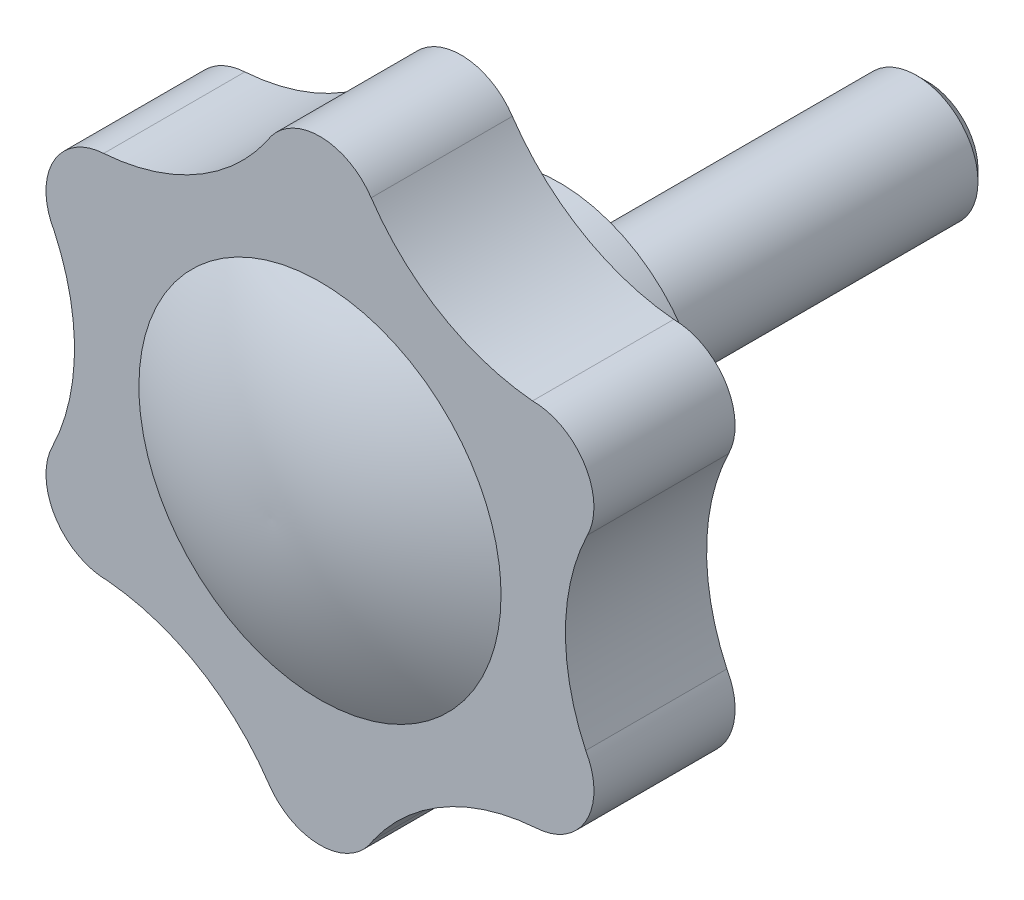
ISO-10303-21;
HEADER;
FILE_DESCRIPTION(('STEP AP214'),'2;1');
FILE_NAME('part.step','',(''),(''),'','','');
FILE_SCHEMA(('AUTOMOTIVE_DESIGN { 1 0 10303 214 1 1 1 1 }'));
ENDSEC;
DATA;
#1=APPLICATION_CONTEXT('core data for automotive mechanical design processes');
#2=APPLICATION_PROTOCOL_DEFINITION('international standard','automotive_design',2000,#1);
#3=PRODUCT_CONTEXT('',#1,'mechanical');
#4=PRODUCT('Part','Part','',(#3));
#5=PRODUCT_RELATED_PRODUCT_CATEGORY('part','',(#4));
#6=PRODUCT_DEFINITION_FORMATION('','',#4);
#7=PRODUCT_DEFINITION_CONTEXT('part definition',#1,'design');
#8=PRODUCT_DEFINITION('design','',#6,#7);
#9=PRODUCT_DEFINITION_SHAPE('','',#8);
#10=(LENGTH_UNIT() NAMED_UNIT(*) SI_UNIT(.MILLI.,.METRE.));
#11=(NAMED_UNIT(*) PLANE_ANGLE_UNIT() SI_UNIT($,.RADIAN.));
#12=(NAMED_UNIT(*) SI_UNIT($,.STERADIAN.) SOLID_ANGLE_UNIT());
#13=UNCERTAINTY_MEASURE_WITH_UNIT(LENGTH_MEASURE(1.E-05),#10,'distance_accuracy_value','');
#14=(GEOMETRIC_REPRESENTATION_CONTEXT(3) GLOBAL_UNCERTAINTY_ASSIGNED_CONTEXT((#13)) GLOBAL_UNIT_ASSIGNED_CONTEXT((#10,
#11,#12)) REPRESENTATION_CONTEXT('',''));
#15=CARTESIAN_POINT('',(0.,0.,0.));
#16=DIRECTION('',(0.,0.,1.));
#17=DIRECTION('',(1.,0.,0.));
#18=AXIS2_PLACEMENT_3D('',#15,#16,#17);
#19=CARTESIAN_POINT('',(9.05529978597193,10.6755648382448,5.75));
#20=DIRECTION('',(0.,0.,1.));
#21=DIRECTION('',(1.,0.,0.));
#22=AXIS2_PLACEMENT_3D('',#19,#20,#21);
#23=PLANE('',#22);
#24=CARTESIAN_POINT('',(9.45034553409947,16.3511296764895,5.75));
#25=DIRECTION('',(0.,0.,-1.));
#26=DIRECTION('',(1.,0.,0.));
#27=AXIS2_PLACEMENT_3D('',#24,#25,#26);
#28=CIRCLE('',#27,8.8863232623222);
#29=CARTESIAN_POINT('',(8.66025403784439,7.50000000000022,5.75));
#30=VERTEX_POINT('',#29);
#31=CARTESIAN_POINT('',(2.0863780504961,11.3773258984016,5.75));
#32=VERTEX_POINT('',#31);
#33=EDGE_CURVE('E216',#30,#32,#28,.T.);
#34=ORIENTED_EDGE('',*,*,#33,.T.);
#35=CARTESIAN_POINT('',(0.,10.,5.75));
#36=DIRECTION('',(0.,0.,1.));
#37=DIRECTION('',(1.,0.,0.));
#38=AXIS2_PLACEMENT_3D('',#35,#36,#37);
#39=CIRCLE('',#38,2.49999999999994);
#40=CARTESIAN_POINT('',(-2.16506350946132,11.2499999999995,5.75));
#41=VERTEX_POINT('',#40);
#42=EDGE_CURVE('E144',#32,#41,#39,.T.);
#43=ORIENTED_EDGE('',*,*,#42,.T.);
#44=CARTESIAN_POINT('',(-9.43532091336402,16.3598041453152,5.75));
#45=DIRECTION('',(0.,0.,-1.));
#46=DIRECTION('',(1.,0.,0.));
#47=AXIS2_PLACEMENT_3D('',#44,#45,#46);
#48=CIRCLE('',#47,8.8863232623222);
#49=CARTESIAN_POINT('',(-8.80986422990251,7.49551934282819,5.75));
#50=VERTEX_POINT('',#49);
#51=EDGE_CURVE('E261',#41,#50,#48,.T.);
#52=ORIENTED_EDGE('',*,*,#51,.T.);
#53=CARTESIAN_POINT('',(-8.66025403784439,5.,5.75));
#54=DIRECTION('',(0.,0.,1.));
#55=DIRECTION('',(1.,0.,0.));
#56=AXIS2_PLACEMENT_3D('',#53,#54,#55);
#57=CIRCLE('',#56,2.49999999999987);
#58=CARTESIAN_POINT('',(-10.8253175473049,3.74999999999924,5.75));
#59=VERTEX_POINT('',#58);
#60=EDGE_CURVE('E258',#50,#59,#57,.T.);
#61=ORIENTED_EDGE('',*,*,#60,.T.);
#62=CARTESIAN_POINT('',(-18.8856664474631,0.00867446882521993,5.75));
#63=DIRECTION('',(0.,0.,-1.));
#64=DIRECTION('',(1.,0.,0.));
#65=AXIS2_PLACEMENT_3D('',#62,#63,#64);
#66=CIRCLE('',#65,8.8863232623222);
#67=CARTESIAN_POINT('',(-10.8962422803983,-3.88180655557386,5.75));
#68=VERTEX_POINT('',#67);
#69=EDGE_CURVE('E260',#59,#68,#66,.T.);
#70=ORIENTED_EDGE('',*,*,#69,.T.);
#71=CARTESIAN_POINT('',(-8.6602540378441,-5.00000000000092,5.75));
#72=DIRECTION('',(0.,0.,1.));
#73=DIRECTION('',(1.,0.,0.));
#74=AXIS2_PLACEMENT_3D('',#71,#72,#73);
#75=CIRCLE('',#74,2.49999999999996);
#76=CARTESIAN_POINT('',(-8.6602540378436,-7.50000000000088,5.75));
#77=VERTEX_POINT('',#76);
#78=EDGE_CURVE('E263',#68,#77,#75,.T.);
#79=ORIENTED_EDGE('',*,*,#78,.T.);
#80=CARTESIAN_POINT('',(-9.45034553409868,-16.3511296764904,5.75));
#81=DIRECTION('',(0.,0.,-1.));
#82=DIRECTION('',(1.,0.,0.));
#83=AXIS2_PLACEMENT_3D('',#80,#81,#82);
#84=CIRCLE('',#83,8.8863232623222);
#85=CARTESIAN_POINT('',(-2.08637805049537,-11.3773258984025,5.75));
#86=VERTEX_POINT('',#85);
#87=EDGE_CURVE('E269',#77,#86,#84,.T.);
#88=ORIENTED_EDGE('',*,*,#87,.T.);
#89=CARTESIAN_POINT('',(7.7664604056078E-13,-10.0000000000008,5.75));
#90=DIRECTION('',(0.,0.,1.));
#91=DIRECTION('',(1.,0.,0.));
#92=AXIS2_PLACEMENT_3D('',#89,#90,#91);
#93=CIRCLE('',#92,2.49999999999993);
#94=CARTESIAN_POINT('',(2.16506350946209,-11.2500000000003,5.75));
#95=VERTEX_POINT('',#94);
#96=EDGE_CURVE('E271',#86,#95,#93,.T.);
#97=ORIENTED_EDGE('',*,*,#96,.T.);
#98=CARTESIAN_POINT('',(9.4353209133648,-16.359804145316,5.75));
#99=DIRECTION('',(0.,0.,-1.));
#100=DIRECTION('',(1.,0.,0.));
#101=AXIS2_PLACEMENT_3D('',#98,#99,#100);
#102=CIRCLE('',#101,8.8863232623222);
#103=CARTESIAN_POINT('',(8.8098642299033,-7.49551934282901,5.75));
#104=VERTEX_POINT('',#103);
#105=EDGE_CURVE('E176',#95,#104,#102,.T.);
#106=ORIENTED_EDGE('',*,*,#105,.T.);
#107=CARTESIAN_POINT('',(8.66025403784533,-5.00000000000034,5.75));
#108=DIRECTION('',(0.,0.,1.));
#109=DIRECTION('',(1.,0.,0.));
#110=AXIS2_PLACEMENT_3D('',#107,#108,#109);
#111=CIRCLE('',#110,2.49999999999992);
#112=CARTESIAN_POINT('',(10.825317547306,-3.74999999999985,5.75));
#113=VERTEX_POINT('',#112);
#114=EDGE_CURVE('E170',#104,#113,#111,.T.);
#115=ORIENTED_EDGE('',*,*,#114,.T.);
#116=CARTESIAN_POINT('',(18.8856664474639,-0.00867446882604154,5.75));
#117=DIRECTION('',(0.,0.,-1.));
#118=DIRECTION('',(1.,0.,0.));
#119=AXIS2_PLACEMENT_3D('',#116,#117,#118);
#120=CIRCLE('',#119,8.8863232623222);
#121=CARTESIAN_POINT('',(10.8962422803991,3.88180655557303,5.75));
#122=VERTEX_POINT('',#121);
#123=EDGE_CURVE('E174',#113,#122,#120,.T.);
#124=ORIENTED_EDGE('',*,*,#123,.T.);
#125=CARTESIAN_POINT('',(8.66025403784439,5.,5.75));
#126=DIRECTION('',(0.,0.,1.));
#127=DIRECTION('',(1.,0.,0.));
#128=AXIS2_PLACEMENT_3D('',#125,#126,#127);
#129=CIRCLE('',#128,2.50000000000022);
#130=EDGE_CURVE('E87',#122,#30,#129,.T.);
#131=ORIENTED_EDGE('',*,*,#130,.T.);
#132=EDGE_LOOP('',(#34,#43,#52,#61,#70,#79,#88,#97,#106,#115,#124,#131));
#133=FACE_BOUND('',#132,.T.);
#134=CARTESIAN_POINT('',(7.375,0.,5.75));
#135=CARTESIAN_POINT('',(7.37500215699948,-0.2071015168034,5.75));
#136=CARTESIAN_POINT('',(7.36643724616385,-0.414178760735558,5.75));
#137=CARTESIAN_POINT('',(7.33198035853699,-0.826952835234037,5.75));
#138=CARTESIAN_POINT('',(7.30608462831733,-1.03264935702082,5.75));
#139=CARTESIAN_POINT('',(7.23696379217308,-1.44127827046624,5.75));
#140=CARTESIAN_POINT('',(7.19372484035667,-1.64420831936026,5.75));
#141=CARTESIAN_POINT('',(7.09016710420186,-2.04566587390744,5.75));
#142=CARTESIAN_POINT('',(7.02984820242894,-2.24419334928023,5.75));
#143=CARTESIAN_POINT('',(6.89259099937075,-2.63535306118094,5.75));
#144=CARTESIAN_POINT('',(6.81565741070114,-2.82798695172234,5.75));
#145=CARTESIAN_POINT('',(6.6457598143647,-3.20605301995944,5.75));
#146=CARTESIAN_POINT('',(6.55279552378518,-3.391485070485,5.75));
#147=CARTESIAN_POINT('',(6.35158030540486,-3.75382350604384,5.75));
#148=CARTESIAN_POINT('',(6.24333158079938,-3.93073111492332,5.75));
#149=CARTESIAN_POINT('',(6.01232686725295,-4.27488983668359,5.75));
#150=CARTESIAN_POINT('',(5.88956606401391,-4.44213771746057,5.75));
#151=CARTESIAN_POINT('',(5.63063742735414,-4.76556439228435,5.75));
#152=CARTESIAN_POINT('',(5.49448664426864,-4.92175683880939,5.75));
#153=CARTESIAN_POINT('',(5.20962058026364,-5.22222990770088,5.75));
#154=CARTESIAN_POINT('',(5.06090528099595,-5.36651051267165,5.75));
#155=CARTESIAN_POINT('',(4.75193101839477,-5.64215988463902,5.75));
#156=CARTESIAN_POINT('',(4.59167108138007,-5.77352756033738,5.75));
#157=CARTESIAN_POINT('',(4.26077108116771,-6.0223476734007,5.75));
#158=CARTESIAN_POINT('',(4.09013442410211,-6.13980464000352,5.75));
#159=CARTESIAN_POINT('',(3.73818099790206,-6.36086614205985,5.75));
#160=CARTESIAN_POINT('',(3.55678906777201,-6.46435106971172,5.75));
#161=CARTESIAN_POINT('',(3.18586114692121,-6.65552836120073,5.75));
#162=CARTESIAN_POINT('',(2.99632506475455,-6.74322054765301,5.75));
#163=CARTESIAN_POINT('',(2.61046700476009,-6.90211016649936,5.75));
#164=CARTESIAN_POINT('',(2.41414527039783,-6.97330818999057,5.75));
#165=CARTESIAN_POINT('',(2.01613649709666,-7.09865603826804,5.75));
#166=CARTESIAN_POINT('',(1.81444957256483,-7.15280622626607,5.75));
#167=CARTESIAN_POINT('',(1.40959007131627,-7.24315053606025,5.75));
#168=CARTESIAN_POINT('',(1.20646296399765,-7.27954861421184,5.75));
#169=CARTESIAN_POINT('',(0.797865262421906,-7.33515512427743,5.75));
#170=CARTESIAN_POINT('',(0.592394573870345,-7.35436286204641,5.75));
#171=CARTESIAN_POINT('',(0.180549563116176,-7.37569157846617,5.75));
#172=CARTESIAN_POINT('',(-0.0258248661784806,-7.3778104741094,5.75));
#173=CARTESIAN_POINT('',(-0.438045011433075,-7.36501891524043,5.75));
#174=CARTESIAN_POINT('',(-0.643890737383631,-7.35010878492477,5.75));
#175=CARTESIAN_POINT('',(-1.05586571159236,-7.30282271177613,5.75));
#176=CARTESIAN_POINT('',(-1.26197325118593,-7.27025677208752,5.75));
#177=CARTESIAN_POINT('',(-1.67066218420943,-7.18767258835538,5.75));
#178=CARTESIAN_POINT('',(-1.8732435822694,-7.13765436722962,5.75));
#179=CARTESIAN_POINT('',(-2.27330584778069,-7.02051699716461,5.75));
#180=CARTESIAN_POINT('',(-2.47078887608537,-6.95340522856097,5.75));
#181=CARTESIAN_POINT('',(-2.85938405560486,-6.80255720579462,5.75));
#182=CARTESIAN_POINT('',(-3.05049380498847,-6.71881476507475,5.75));
#183=CARTESIAN_POINT('',(-3.42264035119899,-6.53649411801637,5.75));
#184=CARTESIAN_POINT('',(-3.60377083118179,-6.43810700784533,5.75));
#185=CARTESIAN_POINT('',(-3.95723242014335,-6.22648844981716,5.75));
#186=CARTESIAN_POINT('',(-4.12956022489122,-6.11325148389357,5.75));
#187=CARTESIAN_POINT('',(-4.4641543607325,-5.87282248555664,5.75));
#188=CARTESIAN_POINT('',(-4.6264219469708,-5.74563219950991,5.75));
#189=CARTESIAN_POINT('',(-4.93989245854765,-5.47814130536602,5.75));
#190=CARTESIAN_POINT('',(-5.09109027248077,-5.3378347081201,5.75));
#191=CARTESIAN_POINT('',(-5.38270440542078,-5.04372820638746,5.75));
#192=CARTESIAN_POINT('',(-5.52300261940934,-4.88981117004053,5.75));
#193=CARTESIAN_POINT('',(-5.79011536187316,-4.57080881228711,5.75));
#194=CARTESIAN_POINT('',(-5.91693595040372,-4.4057285653907,5.75));
#195=CARTESIAN_POINT('',(-6.15624762866462,-4.06545132876569,5.75));
#196=CARTESIAN_POINT('',(-6.26873664991673,-3.89025288396661,5.75));
#197=CARTESIAN_POINT('',(-6.47846296566093,-3.53104227684164,5.75));
#198=CARTESIAN_POINT('',(-6.57570615053676,-3.34703355450402,5.75));
#199=CARTESIAN_POINT('',(-6.75428333607591,-2.97131365217921,5.75));
#200=CARTESIAN_POINT('',(-6.83560772553113,-2.77959790263384,5.75));
#201=CARTESIAN_POINT('',(-6.98160402658373,-2.39000864808518,5.75));
#202=CARTESIAN_POINT('',(-7.04628221774615,-2.19213749679534,5.75));
#203=CARTESIAN_POINT('',(-7.15856007482765,-1.79152026250285,5.75));
#204=CARTESIAN_POINT('',(-7.20615268448553,-1.58877220215975,5.75));
#205=CARTESIAN_POINT('',(-7.2839249338479,-1.17996195632506,5.75));
#206=CARTESIAN_POINT('',(-7.31410436948327,-0.973899732023092,5.75));
#207=CARTESIAN_POINT('',(-7.35673475265588,-0.562021140218349,5.75));
#208=CARTESIAN_POINT('',(-7.36935827712248,-0.356222539991588,5.75));
#209=CARTESIAN_POINT('',(-7.37763506603943,0.0557153158447144,5.75));
#210=CARTESIAN_POINT('',(-7.3732881683149,0.261854574690883,5.75));
#211=CARTESIAN_POINT('',(-7.34750304804223,0.673040278974245,5.75));
#212=CARTESIAN_POINT('',(-7.32606716535974,0.878086870153109,5.75));
#213=CARTESIAN_POINT('',(-7.26605133341746,1.28565157736717,5.75));
#214=CARTESIAN_POINT('',(-7.22747198006436,1.48816978103754,5.75));
#215=CARTESIAN_POINT('',(-7.13281915799178,1.89157715206769,5.75));
#216=CARTESIAN_POINT('',(-7.07654654323346,2.09241963441665,5.75));
#217=CARTESIAN_POINT('',(-6.94703288512184,2.48864076076582,5.75));
#218=CARTESIAN_POINT('',(-6.87378537317265,2.68401728997536,5.75));
#219=CARTESIAN_POINT('',(-6.71093457054431,3.06775344070444,5.75));
#220=CARTESIAN_POINT('',(-6.62133661833268,3.25611532842572,5.75));
#221=CARTESIAN_POINT('',(-6.42644276765985,3.62462515982411,5.75));
#222=CARTESIAN_POINT('',(-6.32114090039381,3.80476994616801,5.75));
#223=CARTESIAN_POINT('',(-6.09694011499248,4.15356018296155,5.75));
#224=CARTESIAN_POINT('',(-5.97820529652718,4.3223111736354,5.75));
#225=CARTESIAN_POINT('',(-5.72703268482299,4.64940663956582,5.75));
#226=CARTESIAN_POINT('',(-5.59458876618694,4.80774641084028,5.75));
#227=CARTESIAN_POINT('',(-5.3170032258008,5.1128413435407,5.75));
#228=CARTESIAN_POINT('',(-5.17186302035428,5.25959779365046,5.75));
#229=CARTESIAN_POINT('',(-4.86987937563816,5.54053078898104,5.75));
#230=CARTESIAN_POINT('',(-4.7130359138955,5.67470731004427,5.75));
#231=CARTESIAN_POINT('',(-4.3867751405252,5.93105012643665,5.75));
#232=CARTESIAN_POINT('',(-4.21723001707706,6.05305382165916,5.75));
#233=CARTESIAN_POINT('',(-3.86849248933539,6.28223960657798,5.75));
#234=CARTESIAN_POINT('',(-3.68930376890923,6.38942730095082,5.75));
#235=CARTESIAN_POINT('',(-3.32244901852327,6.58821399172824,5.75));
#236=CARTESIAN_POINT('',(-3.13478200073046,6.67981116567409,5.75));
#237=CARTESIAN_POINT('',(-2.75239009188168,6.84664263056743,5.75));
#238=CARTESIAN_POINT('',(-2.55766780785087,6.92188289512588,5.75));
#239=CARTESIAN_POINT('',(-2.16397526380981,7.05495377702795,5.75));
#240=CARTESIAN_POINT('',(-1.96504731330585,7.11290958853469,5.75));
#241=CARTESIAN_POINT('',(-1.5629983096568,7.21174397229963,5.75));
#242=CARTESIAN_POINT('',(-1.35987734237408,7.25262289388604,5.75));
#243=CARTESIAN_POINT('',(-0.950847465072705,7.31709003975239,5.75));
#244=CARTESIAN_POINT('',(-0.744937697415175,7.34067281606518,5.75));
#245=CARTESIAN_POINT('',(-0.331869453748655,7.37054230398621,5.75));
#246=CARTESIAN_POINT('',(-0.124710942478123,7.37682852486634,5.75));
#247=CARTESIAN_POINT('',(0.289663799978716,7.37226618450076,5.75));
#248=CARTESIAN_POINT('',(0.496879810452618,7.36139738057411,5.75));
#249=CARTESIAN_POINT('',(0.909659801411309,7.32227848673255,5.75));
#250=CARTESIAN_POINT('',(1.11522388164417,7.29402945439498,5.75));
#251=CARTESIAN_POINT('',(1.52315707114127,7.2202362111778,5.75));
#252=CARTESIAN_POINT('',(1.72552719157819,7.1746975932257,5.75));
#253=CARTESIAN_POINT('',(2.12567414736956,7.06659667015174,5.75));
#254=CARTESIAN_POINT('',(2.32345087946027,7.00403398271395,5.75));
#255=CARTESIAN_POINT('',(2.71267848570262,6.86246006058842,5.75));
#256=CARTESIAN_POINT('',(2.90413867927253,6.78347444086057,5.75));
#257=CARTESIAN_POINT('',(3.27977091849686,6.60957981698072,5.75));
#258=CARTESIAN_POINT('',(3.46394021299176,6.51466487149526,5.75));
#259=CARTESIAN_POINT('',(3.82361108517148,6.30968650153619,5.75));
#260=CARTESIAN_POINT('',(3.9991138243101,6.19962511444982,5.75));
#261=CARTESIAN_POINT('',(4.34033580087152,5.96513904433122,5.75));
#262=CARTESIAN_POINT('',(4.5060515524351,5.84070928975465,5.75));
#263=CARTESIAN_POINT('',(4.82653504429011,5.57840347605992,5.75));
#264=CARTESIAN_POINT('',(4.9813003744724,5.44052447264384,5.75));
#265=CARTESIAN_POINT('',(5.27877636106974,5.15232375831554,5.75));
#266=CARTESIAN_POINT('',(5.421487000355,5.00200202972275,5.75));
#267=CARTESIAN_POINT('',(5.69389644312637,4.68990446537646,5.75));
#268=CARTESIAN_POINT('',(5.82359070242016,4.52812466284511,5.75));
#269=CARTESIAN_POINT('',(6.0689258605809,4.19432487042833,5.75));
#270=CARTESIAN_POINT('',(6.18457165459882,4.02230847876315,5.75));
#271=CARTESIAN_POINT('',(6.40187993155494,3.66771454175609,5.75));
#272=CARTESIAN_POINT('',(6.50342028558945,3.48506211265351,5.75));
#273=CARTESIAN_POINT('',(6.69055226312114,3.1118469554571,5.75));
#274=CARTESIAN_POINT('',(6.77614983356577,2.92128720950085,5.75));
#275=CARTESIAN_POINT('',(6.93068449416246,2.53374295572171,5.75));
#276=CARTESIAN_POINT('',(6.99963808861232,2.33676503409095,5.75));
#277=CARTESIAN_POINT('',(7.12044453657761,1.93770465438328,5.75));
#278=CARTESIAN_POINT('',(7.17230204307891,1.73562360135559,5.75));
#279=CARTESIAN_POINT('',(7.26865698590813,1.28016009357466,5.75));
#280=CARTESIAN_POINT('',(7.30861664937382,1.02580551124675,5.75));
#281=CARTESIAN_POINT('',(7.36178910819854,0.514288463228184,5.75));
#282=CARTESIAN_POINT('',(7.3749973219915,0.257125524147552,5.75));
#283=CARTESIAN_POINT('',(7.375,0.,5.75));
#284=B_SPLINE_CURVE_WITH_KNOTS('',3,(#134,#135,#136,#137,#138,#139,#140,#141,#142,#143,#144,
#145,#146,#147,#148,#149,#150,#151,#152,#153,#154,#155,#156,#157,#158,#159,#160,#161,#162,#163,
#164,#165,#166,#167,#168,#169,#170,#171,#172,#173,#174,#175,#176,#177,#178,#179,#180,#181,#182,
#183,#184,#185,#186,#187,#188,#189,#190,#191,#192,#193,#194,#195,#196,#197,#198,#199,#200,#201,
#202,#203,#204,#205,#206,#207,#208,#209,#210,#211,#212,#213,#214,#215,#216,#217,#218,#219,#220,
#221,#222,#223,#224,#225,#226,#227,#228,#229,#230,#231,#232,#233,#234,#235,#236,#237,#238,#239,
#240,#241,#242,#243,#244,#245,#246,#247,#248,#249,#250,#251,#252,#253,#254,#255,#256,#257,#258,
#259,#260,#261,#262,#263,#264,#265,#266,#267,#268,#269,#270,#271,#272,#273,#274,#275,#276,#277,
#278,#279,#280,#281,#282,#283),.UNSPECIFIED.,.T.,.F.,(4,2,2,2,2,2,2,2,2,2,2,2,2,2,2,2,2,2,2,2,2,
2,2,2,2,2,2,2,2,2,2,2,2,2,2,2,2,2,2,2,2,2,2,2,2,2,2,2,2,2,2,2,2,2,2,2,2,2,2,2,2,2,2,2,2,2,2,2,2,
2,2,2,2,2,4),(0.,0.621079105681045,1.24229276533969,1.8640033587179,2.48571822681925,
3.1072569818149,3.72880670696047,4.35026692927673,4.97193389906254,5.59281926439441,
6.21370553643226,6.83464423581452,7.45538020245419,8.08113218135389,8.70689118829291,
9.33262776659514,9.9583510123967,10.5767051803579,11.1950843163011,11.8135388270961,
12.4319815640252,13.057215516892,13.6824486487249,14.3074122852279,14.9326088431739,
15.5502656407162,16.1681526075144,16.7859623289868,17.4040555446486,18.0281126232363,
18.651887904012,19.2757531126647,19.8993766874834,20.5233756306905,21.1471388321157,
21.7711593491194,22.395187179019,23.0130363034608,23.6308913322849,24.2486617774125,
24.8664107505315,25.4913779303689,26.1165836581597,26.741585618462,27.3668257402391,
27.9851179219078,28.6036875666333,29.2221882960996,29.8406902132655,30.4665798613822,
31.0922320928103,31.7179574098964,32.3434538241844,32.9643030260389,33.5851395270583,
34.2061714962543,34.8272210848371,35.449004050978,36.0707491857094,36.6922933661307,
37.3138515059564,37.9344473733328,38.5552752276098,39.1760196541946,39.7969838560287,
40.4180843052124,41.039185636968,41.6605030546969,42.2816033511938,42.907784532992,
43.5337316679958,44.159055535268,44.78420906943,45.5551737149592,46.3262703879832),.UNSPECIFIED.);
#285=CARTESIAN_POINT('',(7.375,0.,5.75));
#286=VERTEX_POINT('',#285);
#287=EDGE_CURVE('E67',#286,#286,#284,.F.);
#288=ORIENTED_EDGE('',*,*,#287,.F.);
#289=EDGE_LOOP('',(#288));
#290=FACE_BOUND('',#289,.T.);
#291=ADVANCED_FACE('F63',(#133,#290),#23,.T.);
#292=CARTESIAN_POINT('',(9.45034553409947,16.3511296764895,5.75));
#293=DIRECTION('',(0.,0.,-1.));
#294=DIRECTION('',(-1.,0.,0.));
#295=AXIS2_PLACEMENT_3D('',#292,#293,#294);
#296=CYLINDRICAL_SURFACE('',#295,8.8863232623222);
#297=CARTESIAN_POINT('',(9.45034553409947,16.3511296764895,0.));
#298=DIRECTION('',(0.,0.,-1.));
#299=DIRECTION('',(1.,0.,0.));
#300=AXIS2_PLACEMENT_3D('',#297,#298,#299);
#301=CIRCLE('',#300,8.8863232623222);
#302=CARTESIAN_POINT('',(8.66025403784439,7.50000000000022,0.));
#303=VERTEX_POINT('',#302);
#304=CARTESIAN_POINT('',(2.0863780504961,11.3773258984016,0.));
#305=VERTEX_POINT('',#304);
#306=EDGE_CURVE('E194',#303,#305,#301,.T.);
#307=ORIENTED_EDGE('',*,*,#306,.T.);
#308=DIRECTION('',(0.,0.,-1.));
#309=VECTOR('',#308,1.);
#310=CARTESIAN_POINT('',(2.0863780504961,11.3773258984016,5.75));
#311=LINE('',#310,#309);
#312=EDGE_CURVE('E78',#32,#305,#311,.T.);
#313=ORIENTED_EDGE('',*,*,#312,.F.);
#314=ORIENTED_EDGE('',*,*,#33,.F.);
#315=DIRECTION('',(0.,0.,-1.));
#316=VECTOR('',#315,1.);
#317=CARTESIAN_POINT('',(8.66025403784439,7.50000000000022,5.75));
#318=LINE('',#317,#316);
#319=EDGE_CURVE('E190',#30,#303,#318,.T.);
#320=ORIENTED_EDGE('',*,*,#319,.T.);
#321=EDGE_LOOP('',(#307,#313,#314,#320));
#322=FACE_BOUND('',#321,.T.);
#323=ADVANCED_FACE('F65',(#322),#296,.F.);
#324=CARTESIAN_POINT('',(0.,10.,5.75));
#325=DIRECTION('',(0.,0.,-1.));
#326=DIRECTION('',(-1.,0.,0.));
#327=AXIS2_PLACEMENT_3D('',#324,#325,#326);
#328=CYLINDRICAL_SURFACE('',#327,2.49999999999994);
#329=CARTESIAN_POINT('',(0.,10.,0.));
#330=DIRECTION('',(0.,0.,1.));
#331=DIRECTION('',(1.,0.,0.));
#332=AXIS2_PLACEMENT_3D('',#329,#330,#331);
#333=CIRCLE('',#332,2.49999999999994);
#334=CARTESIAN_POINT('',(-2.16506350946132,11.2499999999995,0.));
#335=VERTEX_POINT('',#334);
#336=EDGE_CURVE('E197',#305,#335,#333,.T.);
#337=ORIENTED_EDGE('',*,*,#336,.T.);
#338=DIRECTION('',(0.,0.,-1.));
#339=VECTOR('',#338,1.);
#340=CARTESIAN_POINT('',(-2.16506350946132,11.2499999999995,5.75));
#341=LINE('',#340,#339);
#342=EDGE_CURVE('E238',#41,#335,#341,.T.);
#343=ORIENTED_EDGE('',*,*,#342,.F.);
#344=ORIENTED_EDGE('',*,*,#42,.F.);
#345=ORIENTED_EDGE('',*,*,#312,.T.);
#346=EDGE_LOOP('',(#337,#343,#344,#345));
#347=FACE_BOUND('',#346,.T.);
#348=ADVANCED_FACE('F241',(#347),#328,.T.);
#349=CARTESIAN_POINT('',(-9.43532091336402,16.3598041453152,5.75));
#350=DIRECTION('',(0.,0.,-1.));
#351=DIRECTION('',(-1.,0.,0.));
#352=AXIS2_PLACEMENT_3D('',#349,#350,#351);
#353=CYLINDRICAL_SURFACE('',#352,8.8863232623222);
#354=CARTESIAN_POINT('',(-9.43532091336402,16.3598041453152,0.));
#355=DIRECTION('',(0.,0.,-1.));
#356=DIRECTION('',(1.,0.,0.));
#357=AXIS2_PLACEMENT_3D('',#354,#355,#356);
#358=CIRCLE('',#357,8.8863232623222);
#359=CARTESIAN_POINT('',(-8.80986422990251,7.49551934282819,0.));
#360=VERTEX_POINT('',#359);
#361=EDGE_CURVE('E199',#335,#360,#358,.T.);
#362=ORIENTED_EDGE('',*,*,#361,.T.);
#363=DIRECTION('',(0.,0.,-1.));
#364=VECTOR('',#363,1.);
#365=CARTESIAN_POINT('',(-8.80986422990251,7.49551934282819,5.75));
#366=LINE('',#365,#364);
#367=EDGE_CURVE('E235',#50,#360,#366,.T.);
#368=ORIENTED_EDGE('',*,*,#367,.F.);
#369=ORIENTED_EDGE('',*,*,#51,.F.);
#370=ORIENTED_EDGE('',*,*,#342,.T.);
#371=EDGE_LOOP('',(#362,#368,#369,#370));
#372=FACE_BOUND('',#371,.T.);
#373=ADVANCED_FACE('F252',(#372),#353,.F.);
#374=CARTESIAN_POINT('',(-8.66025403784439,5.,5.75));
#375=DIRECTION('',(0.,0.,-1.));
#376=DIRECTION('',(-1.,0.,0.));
#377=AXIS2_PLACEMENT_3D('',#374,#375,#376);
#378=CYLINDRICAL_SURFACE('',#377,2.49999999999987);
#379=CARTESIAN_POINT('',(-8.66025403784439,5.,0.));
#380=DIRECTION('',(0.,0.,1.));
#381=DIRECTION('',(1.,0.,0.));
#382=AXIS2_PLACEMENT_3D('',#379,#380,#381);
#383=CIRCLE('',#382,2.49999999999987);
#384=CARTESIAN_POINT('',(-10.8253175473049,3.74999999999924,0.));
#385=VERTEX_POINT('',#384);
#386=EDGE_CURVE('E201',#360,#385,#383,.T.);
#387=ORIENTED_EDGE('',*,*,#386,.T.);
#388=DIRECTION('',(0.,0.,-1.));
#389=VECTOR('',#388,1.);
#390=CARTESIAN_POINT('',(-10.8253175473049,3.74999999999924,5.75));
#391=LINE('',#390,#389);
#392=EDGE_CURVE('E232',#59,#385,#391,.T.);
#393=ORIENTED_EDGE('',*,*,#392,.F.);
#394=ORIENTED_EDGE('',*,*,#60,.F.);
#395=ORIENTED_EDGE('',*,*,#367,.T.);
#396=EDGE_LOOP('',(#387,#393,#394,#395));
#397=FACE_BOUND('',#396,.T.);
#398=ADVANCED_FACE('F256',(#397),#378,.T.);
#399=CARTESIAN_POINT('',(-18.8856664474631,0.00867446882521993,5.75));
#400=DIRECTION('',(0.,0.,-1.));
#401=DIRECTION('',(-1.,0.,0.));
#402=AXIS2_PLACEMENT_3D('',#399,#400,#401);
#403=CYLINDRICAL_SURFACE('',#402,8.8863232623222);
#404=CARTESIAN_POINT('',(-18.8856664474631,0.00867446882521993,0.));
#405=DIRECTION('',(0.,0.,-1.));
#406=DIRECTION('',(1.,0.,0.));
#407=AXIS2_PLACEMENT_3D('',#404,#405,#406);
#408=CIRCLE('',#407,8.8863232623222);
#409=CARTESIAN_POINT('',(-10.8962422803983,-3.88180655557386,0.));
#410=VERTEX_POINT('',#409);
#411=EDGE_CURVE('E203',#385,#410,#408,.T.);
#412=ORIENTED_EDGE('',*,*,#411,.T.);
#413=DIRECTION('',(0.,0.,-1.));
#414=VECTOR('',#413,1.);
#415=CARTESIAN_POINT('',(-10.8962422803983,-3.88180655557386,5.75));
#416=LINE('',#415,#414);
#417=EDGE_CURVE('E229',#68,#410,#416,.T.);
#418=ORIENTED_EDGE('',*,*,#417,.F.);
#419=ORIENTED_EDGE('',*,*,#69,.F.);
#420=ORIENTED_EDGE('',*,*,#392,.T.);
#421=EDGE_LOOP('',(#412,#418,#419,#420));
#422=FACE_BOUND('',#421,.T.);
#423=ADVANCED_FACE('F292',(#422),#403,.F.);
#424=CARTESIAN_POINT('',(-8.6602540378441,-5.00000000000092,5.75));
#425=DIRECTION('',(0.,0.,-1.));
#426=DIRECTION('',(-1.,0.,0.));
#427=AXIS2_PLACEMENT_3D('',#424,#425,#426);
#428=CYLINDRICAL_SURFACE('',#427,2.49999999999996);
#429=CARTESIAN_POINT('',(-8.6602540378441,-5.00000000000092,0.));
#430=DIRECTION('',(0.,0.,1.));
#431=DIRECTION('',(1.,0.,0.));
#432=AXIS2_PLACEMENT_3D('',#429,#430,#431);
#433=CIRCLE('',#432,2.49999999999996);
#434=CARTESIAN_POINT('',(-8.6602540378436,-7.50000000000088,0.));
#435=VERTEX_POINT('',#434);
#436=EDGE_CURVE('E205',#410,#435,#433,.T.);
#437=ORIENTED_EDGE('',*,*,#436,.T.);
#438=DIRECTION('',(0.,0.,-1.));
#439=VECTOR('',#438,1.);
#440=CARTESIAN_POINT('',(-8.6602540378436,-7.50000000000088,5.75));
#441=LINE('',#440,#439);
#442=EDGE_CURVE('E226',#77,#435,#441,.T.);
#443=ORIENTED_EDGE('',*,*,#442,.F.);
#444=ORIENTED_EDGE('',*,*,#78,.F.);
#445=ORIENTED_EDGE('',*,*,#417,.T.);
#446=EDGE_LOOP('',(#437,#443,#444,#445));
#447=FACE_BOUND('',#446,.T.);
#448=ADVANCED_FACE('F289',(#447),#428,.T.);
#449=CARTESIAN_POINT('',(-9.45034553409868,-16.3511296764904,5.75));
#450=DIRECTION('',(0.,0.,-1.));
#451=DIRECTION('',(-1.,0.,0.));
#452=AXIS2_PLACEMENT_3D('',#449,#450,#451);
#453=CYLINDRICAL_SURFACE('',#452,8.8863232623222);
#454=CARTESIAN_POINT('',(-9.45034553409868,-16.3511296764904,0.));
#455=DIRECTION('',(0.,0.,-1.));
#456=DIRECTION('',(1.,0.,0.));
#457=AXIS2_PLACEMENT_3D('',#454,#455,#456);
#458=CIRCLE('',#457,8.8863232623222);
#459=CARTESIAN_POINT('',(-2.08637805049537,-11.3773258984025,0.));
#460=VERTEX_POINT('',#459);
#461=EDGE_CURVE('E207',#435,#460,#458,.T.);
#462=ORIENTED_EDGE('',*,*,#461,.T.);
#463=DIRECTION('',(0.,0.,-1.));
#464=VECTOR('',#463,1.);
#465=CARTESIAN_POINT('',(-2.08637805049537,-11.3773258984025,5.75));
#466=LINE('',#465,#464);
#467=EDGE_CURVE('E223',#86,#460,#466,.T.);
#468=ORIENTED_EDGE('',*,*,#467,.F.);
#469=ORIENTED_EDGE('',*,*,#87,.F.);
#470=ORIENTED_EDGE('',*,*,#442,.T.);
#471=EDGE_LOOP('',(#462,#468,#469,#470));
#472=FACE_BOUND('',#471,.T.);
#473=ADVANCED_FACE('F285',(#472),#453,.F.);
#474=CARTESIAN_POINT('',(7.7664604056078E-13,-10.0000000000008,5.75));
#475=DIRECTION('',(0.,0.,-1.));
#476=DIRECTION('',(-1.,0.,0.));
#477=AXIS2_PLACEMENT_3D('',#474,#475,#476);
#478=CYLINDRICAL_SURFACE('',#477,2.49999999999993);
#479=CARTESIAN_POINT('',(7.7664604056078E-13,-10.0000000000008,0.));
#480=DIRECTION('',(0.,0.,1.));
#481=DIRECTION('',(1.,0.,0.));
#482=AXIS2_PLACEMENT_3D('',#479,#480,#481);
#483=CIRCLE('',#482,2.49999999999993);
#484=CARTESIAN_POINT('',(2.16506350946209,-11.2500000000003,0.));
#485=VERTEX_POINT('',#484);
#486=EDGE_CURVE('E209',#460,#485,#483,.T.);
#487=ORIENTED_EDGE('',*,*,#486,.T.);
#488=DIRECTION('',(0.,0.,-1.));
#489=VECTOR('',#488,1.);
#490=CARTESIAN_POINT('',(2.16506350946209,-11.2500000000003,5.75));
#491=LINE('',#490,#489);
#492=EDGE_CURVE('E220',#95,#485,#491,.T.);
#493=ORIENTED_EDGE('',*,*,#492,.F.);
#494=ORIENTED_EDGE('',*,*,#96,.F.);
#495=ORIENTED_EDGE('',*,*,#467,.T.);
#496=EDGE_LOOP('',(#487,#493,#494,#495));
#497=FACE_BOUND('',#496,.T.);
#498=ADVANCED_FACE('F277',(#497),#478,.T.);
#499=CARTESIAN_POINT('',(9.4353209133648,-16.359804145316,5.75));
#500=DIRECTION('',(0.,0.,-1.));
#501=DIRECTION('',(-1.,0.,0.));
#502=AXIS2_PLACEMENT_3D('',#499,#500,#501);
#503=CYLINDRICAL_SURFACE('',#502,8.8863232623222);
#504=CARTESIAN_POINT('',(9.4353209133648,-16.359804145316,0.));
#505=DIRECTION('',(0.,0.,-1.));
#506=DIRECTION('',(1.,0.,0.));
#507=AXIS2_PLACEMENT_3D('',#504,#505,#506);
#508=CIRCLE('',#507,8.8863232623222);
#509=CARTESIAN_POINT('',(8.8098642299033,-7.49551934282901,0.));
#510=VERTEX_POINT('',#509);
#511=EDGE_CURVE('E211',#485,#510,#508,.T.);
#512=ORIENTED_EDGE('',*,*,#511,.T.);
#513=DIRECTION('',(0.,0.,-1.));
#514=VECTOR('',#513,1.);
#515=CARTESIAN_POINT('',(8.8098642299033,-7.49551934282901,5.75));
#516=LINE('',#515,#514);
#517=EDGE_CURVE('E185',#104,#510,#516,.T.);
#518=ORIENTED_EDGE('',*,*,#517,.F.);
#519=ORIENTED_EDGE('',*,*,#105,.F.);
#520=ORIENTED_EDGE('',*,*,#492,.T.);
#521=EDGE_LOOP('',(#512,#518,#519,#520));
#522=FACE_BOUND('',#521,.T.);
#523=ADVANCED_FACE('F281',(#522),#503,.F.);
#524=CARTESIAN_POINT('',(8.66025403784533,-5.00000000000034,5.75));
#525=DIRECTION('',(0.,0.,-1.));
#526=DIRECTION('',(-1.,0.,0.));
#527=AXIS2_PLACEMENT_3D('',#524,#525,#526);
#528=CYLINDRICAL_SURFACE('',#527,2.49999999999992);
#529=CARTESIAN_POINT('',(8.66025403784533,-5.00000000000034,0.));
#530=DIRECTION('',(0.,0.,1.));
#531=DIRECTION('',(1.,0.,0.));
#532=AXIS2_PLACEMENT_3D('',#529,#530,#531);
#533=CIRCLE('',#532,2.49999999999992);
#534=CARTESIAN_POINT('',(10.825317547306,-3.74999999999985,0.));
#535=VERTEX_POINT('',#534);
#536=EDGE_CURVE('E184',#510,#535,#533,.T.);
#537=ORIENTED_EDGE('',*,*,#536,.T.);
#538=DIRECTION('',(0.,0.,-1.));
#539=VECTOR('',#538,1.);
#540=CARTESIAN_POINT('',(10.825317547306,-3.74999999999985,5.75));
#541=LINE('',#540,#539);
#542=EDGE_CURVE('E181',#113,#535,#541,.T.);
#543=ORIENTED_EDGE('',*,*,#542,.F.);
#544=ORIENTED_EDGE('',*,*,#114,.F.);
#545=ORIENTED_EDGE('',*,*,#517,.T.);
#546=EDGE_LOOP('',(#537,#543,#544,#545));
#547=FACE_BOUND('',#546,.T.);
#548=ADVANCED_FACE('F182',(#547),#528,.T.);
#549=CARTESIAN_POINT('',(18.8856664474639,-0.00867446882604154,5.75));
#550=DIRECTION('',(0.,0.,-1.));
#551=DIRECTION('',(-1.,0.,0.));
#552=AXIS2_PLACEMENT_3D('',#549,#550,#551);
#553=CYLINDRICAL_SURFACE('',#552,8.8863232623222);
#554=CARTESIAN_POINT('',(18.8856664474639,-0.00867446882604154,0.));
#555=DIRECTION('',(0.,0.,-1.));
#556=DIRECTION('',(1.,0.,0.));
#557=AXIS2_PLACEMENT_3D('',#554,#555,#556);
#558=CIRCLE('',#557,8.8863232623222);
#559=CARTESIAN_POINT('',(10.8962422803991,3.88180655557303,0.));
#560=VERTEX_POINT('',#559);
#561=EDGE_CURVE('E129',#535,#560,#558,.T.);
#562=ORIENTED_EDGE('',*,*,#561,.T.);
#563=DIRECTION('',(0.,0.,-1.));
#564=VECTOR('',#563,1.);
#565=CARTESIAN_POINT('',(10.8962422803991,3.88180655557303,5.75));
#566=LINE('',#565,#564);
#567=EDGE_CURVE('E186',#122,#560,#566,.T.);
#568=ORIENTED_EDGE('',*,*,#567,.F.);
#569=ORIENTED_EDGE('',*,*,#123,.F.);
#570=ORIENTED_EDGE('',*,*,#542,.T.);
#571=EDGE_LOOP('',(#562,#568,#569,#570));
#572=FACE_BOUND('',#571,.T.);
#573=ADVANCED_FACE('F188',(#572),#553,.F.);
#574=CARTESIAN_POINT('',(8.66025403784439,5.,5.75));
#575=DIRECTION('',(0.,0.,-1.));
#576=DIRECTION('',(-1.,0.,0.));
#577=AXIS2_PLACEMENT_3D('',#574,#575,#576);
#578=CYLINDRICAL_SURFACE('',#577,2.50000000000022);
#579=CARTESIAN_POINT('',(8.66025403784439,5.,0.));
#580=DIRECTION('',(0.,0.,1.));
#581=DIRECTION('',(1.,0.,0.));
#582=AXIS2_PLACEMENT_3D('',#579,#580,#581);
#583=CIRCLE('',#582,2.50000000000022);
#584=EDGE_CURVE('E135',#560,#303,#583,.T.);
#585=ORIENTED_EDGE('',*,*,#584,.T.);
#586=ORIENTED_EDGE('',*,*,#319,.F.);
#587=ORIENTED_EDGE('',*,*,#130,.F.);
#588=ORIENTED_EDGE('',*,*,#567,.T.);
#589=EDGE_LOOP('',(#585,#586,#587,#588));
#590=FACE_BOUND('',#589,.T.);
#591=ADVANCED_FACE('F314',(#590),#578,.T.);
#592=CARTESIAN_POINT('',(9.05529978597193,10.6755648382448,0.));
#593=DIRECTION('',(0.,0.,1.));
#594=DIRECTION('',(1.,0.,0.));
#595=AXIS2_PLACEMENT_3D('',#592,#593,#594);
#596=PLANE('',#595);
#597=CARTESIAN_POINT('',(0.,0.,0.));
#598=DIRECTION('',(0.,0.,-1.));
#599=DIRECTION('',(-1.,0.,0.));
#600=AXIS2_PLACEMENT_3D('',#597,#598,#599);
#601=CIRCLE('',#600,6.);
#602=CARTESIAN_POINT('',(-6.,0.,0.));
#603=VERTEX_POINT('',#602);
#604=EDGE_CURVE('E13',#603,#603,#601,.T.);
#605=ORIENTED_EDGE('',*,*,#604,.F.);
#606=EDGE_LOOP('',(#605));
#607=FACE_BOUND('',#606,.T.);
#608=ORIENTED_EDGE('',*,*,#306,.F.);
#609=ORIENTED_EDGE('',*,*,#584,.F.);
#610=ORIENTED_EDGE('',*,*,#561,.F.);
#611=ORIENTED_EDGE('',*,*,#536,.F.);
#612=ORIENTED_EDGE('',*,*,#511,.F.);
#613=ORIENTED_EDGE('',*,*,#486,.F.);
#614=ORIENTED_EDGE('',*,*,#461,.F.);
#615=ORIENTED_EDGE('',*,*,#436,.F.);
#616=ORIENTED_EDGE('',*,*,#411,.F.);
#617=ORIENTED_EDGE('',*,*,#386,.F.);
#618=ORIENTED_EDGE('',*,*,#361,.F.);
#619=ORIENTED_EDGE('',*,*,#336,.F.);
#620=EDGE_LOOP('',(#608,#609,#610,#611,#612,#613,#614,#615,#616,#617,#618,#619));
#621=FACE_BOUND('',#620,.T.);
#622=ADVANCED_FACE('F246',(#607,#621),#596,.F.);
#623=CARTESIAN_POINT('',(-7.375,0.,5.75));
#624=CARTESIAN_POINT('',(-5.1600166382331,0.,7.11146496702479));
#625=CARTESIAN_POINT('',(-2.59934899637169,0.,7.80588331058043));
#626=CARTESIAN_POINT('',(0.,0.,7.75));
#627=CARTESIAN_POINT('',(-7.375,-0.20351865990914,5.75));
#628=CARTESIAN_POINT('',(-5.1600166382331,-0.135679106606095,7.11146496702479));
#629=CARTESIAN_POINT('',(-2.59934899637169,-0.0678395533030475,7.80588331058043));
#630=CARTESIAN_POINT('',(0.,0.,7.75));
#631=CARTESIAN_POINT('',(-7.35847686599091,-0.606727247745596,5.75));
#632=CARTESIAN_POINT('',(-5.14900121556038,-0.404484831830399,7.11146496702479));
#633=CARTESIAN_POINT('',(-2.59384128503533,-0.2022424159152,7.80588331058043));
#634=CARTESIAN_POINT('',(0.,0.,7.75));
#635=CARTESIAN_POINT('',(-7.28602692325412,-1.19814977325071,5.75));
#636=CARTESIAN_POINT('',(-5.10070125373585,-0.798766515500475,7.11146496702479));
#637=CARTESIAN_POINT('',(-2.56969130412306,-0.399383257750237,7.80588331058043));
#638=CARTESIAN_POINT('',(0.,0.,7.75));
#639=CARTESIAN_POINT('',(-7.16781589909824,-1.77427778220216,5.75));
#640=CARTESIAN_POINT('',(-5.02189390429859,-1.18285185480144,7.11146496702479));
#641=CARTESIAN_POINT('',(-2.53028762940443,-0.591425927400721,7.80588331058043));
#642=CARTESIAN_POINT('',(0.,0.,7.75));
#643=CARTESIAN_POINT('',(-6.19540822747303,-5.12785377476435,5.75));
#644=CARTESIAN_POINT('',(-4.37362212321512,-3.41856918317623,7.11146496702479));
#645=CARTESIAN_POINT('',(-2.2061517388627,-1.70928459158812,7.80588331058043));
#646=CARTESIAN_POINT('',(0.,0.,7.75));
#647=CARTESIAN_POINT('',(-3.25629855854629,-7.375,5.75));
#648=CARTESIAN_POINT('',(-2.41421567726396,-4.91666666666667,7.11146496702479));
#649=CARTESIAN_POINT('',(-1.22644851588712,-2.45833333333333,7.80588331058043));
#650=CARTESIAN_POINT('',(0.,0.,7.75));
#651=CARTESIAN_POINT('',(4.07037319818286,-7.375,5.75));
#652=CARTESIAN_POINT('',(2.47023216055547,-4.91666666666667,7.11146496702479));
#653=CARTESIAN_POINT('',(1.2157754030226,-2.45833333333333,7.80588331058043));
#654=CARTESIAN_POINT('',(0.,0.,7.75));
#655=CARTESIAN_POINT('',(7.375,-4.07037319818286,5.75));
#656=CARTESIAN_POINT('',(4.67331669510023,-2.71358213212191,7.11146496702479));
#657=CARTESIAN_POINT('',(2.31731767029498,-1.35679106606096,7.80588331058043));
#658=CARTESIAN_POINT('',(0.,0.,7.75));
#659=CARTESIAN_POINT('',(7.375,4.07037319818286,5.75));
#660=CARTESIAN_POINT('',(4.67331669510023,2.71358213212191,7.11146496702479));
#661=CARTESIAN_POINT('',(2.31731767029498,1.35679106606095,7.80588331058043));
#662=CARTESIAN_POINT('',(0.,0.,7.75));
#663=CARTESIAN_POINT('',(4.07037319818286,7.375,5.75));
#664=CARTESIAN_POINT('',(2.47023216055548,4.91666666666666,7.11146496702479));
#665=CARTESIAN_POINT('',(1.2157754030226,2.45833333333333,7.80588331058043));
#666=CARTESIAN_POINT('',(0.,0.,7.75));
#667=CARTESIAN_POINT('',(-3.25629855854629,7.375,5.75));
#668=CARTESIAN_POINT('',(-2.41421567726396,4.91666666666667,7.11146496702479));
#669=CARTESIAN_POINT('',(-1.22644851588712,2.45833333333333,7.80588331058043));
#670=CARTESIAN_POINT('',(0.,0.,7.75));
#671=CARTESIAN_POINT('',(-6.19540822747303,5.12785377476435,5.75));
#672=CARTESIAN_POINT('',(-4.37362212321512,3.41856918317623,7.11146496702479));
#673=CARTESIAN_POINT('',(-2.2061517388627,1.70928459158812,7.80588331058043));
#674=CARTESIAN_POINT('',(0.,0.,7.75));
#675=CARTESIAN_POINT('',(-7.16781589909824,1.77427778220217,5.75));
#676=CARTESIAN_POINT('',(-5.02189390429859,1.18285185480144,7.11146496702479));
#677=CARTESIAN_POINT('',(-2.53028762940443,0.591425927400721,7.80588331058043));
#678=CARTESIAN_POINT('',(0.,0.,7.75));
#679=CARTESIAN_POINT('',(-7.28602692325412,1.19814977325071,5.75));
#680=CARTESIAN_POINT('',(-5.10070125373584,0.798766515500475,7.11146496702479));
#681=CARTESIAN_POINT('',(-2.56969130412306,0.399383257750237,7.80588331058043));
#682=CARTESIAN_POINT('',(0.,0.,7.75));
#683=CARTESIAN_POINT('',(-7.35847686599091,0.606727247745603,5.75));
#684=CARTESIAN_POINT('',(-5.14900121556038,0.4044848318304,7.11146496702479));
#685=CARTESIAN_POINT('',(-2.59384128503532,0.2022424159152,7.80588331058043));
#686=CARTESIAN_POINT('',(0.,0.,7.75));
#687=CARTESIAN_POINT('',(-7.375,0.203518659909145,5.75));
#688=CARTESIAN_POINT('',(-5.1600166382331,0.135679106606095,7.11146496702479));
#689=CARTESIAN_POINT('',(-2.59934899637169,0.0678395533030475,7.80588331058043));
#690=CARTESIAN_POINT('',(0.,0.,7.75));
#691=CARTESIAN_POINT('',(-7.375,0.,5.75));
#692=CARTESIAN_POINT('',(-5.1600166382331,0.,7.11146496702479));
#693=CARTESIAN_POINT('',(-2.59934899637169,0.,7.80588331058043));
#694=CARTESIAN_POINT('',(0.,0.,7.75));
#695=B_SPLINE_SURFACE_WITH_KNOTS('',3,3,((#623,#624,#625,#626),(#627,#628,#629,#630),(#631,#632,
#633,#634),(#635,#636,#637,#638),(#639,#640,#641,#642),(#643,#644,#645,#646),(#647,#648,#649,
#650),(#651,#652,#653,#654),(#655,#656,#657,#658),(#659,#660,#661,#662),(#663,#664,#665,#666),
(#667,#668,#669,#670),(#671,#672,#673,#674),(#675,#676,#677,#678),(#679,#680,#681,#682),(#683,
#684,#685,#686),(#687,#688,#689,#690),(#691,#692,#693,#694)),.UNSPECIFIED.,.T.,.F.,.F.,(4,1,1,1,
1,2,2,2,1,1,1,1,4),(4,4),(0.,0.0125,0.0249999999999999,0.0375000000000001,0.05,0.25,0.5,0.75,
0.95,0.9625,0.975,0.9875,1.),(0.,1.),.UNSPECIFIED.);
#696=CARTESIAN_POINT('',(0.,0.,7.75));
#697=VERTEX_POINT('',#696);
#698=VERTEX_LOOP('',#697);
#699=FACE_BOUND('',#698,.T.);
#700=ORIENTED_EDGE('',*,*,#287,.T.);
#701=EDGE_LOOP('',(#700));
#702=FACE_BOUND('',#701,.T.);
#703=ADVANCED_FACE('F307',(#699,#702),#695,.T.);
#704=CARTESIAN_POINT('',(0.,0.,-4.));
#705=DIRECTION('',(0.,0.,1.));
#706=DIRECTION('',(1.,0.,0.));
#707=AXIS2_PLACEMENT_3D('',#704,#705,#706);
#708=CYLINDRICAL_SURFACE('',#707,6.);
#709=CARTESIAN_POINT('',(0.,0.,-4.));
#710=DIRECTION('',(0.,0.,-1.));
#711=DIRECTION('',(-1.,0.,0.));
#712=AXIS2_PLACEMENT_3D('',#709,#710,#711);
#713=CIRCLE('',#712,6.);
#714=CARTESIAN_POINT('',(-6.,0.,-4.));
#715=VERTEX_POINT('',#714);
#716=EDGE_CURVE('E532',#715,#715,#713,.T.);
#717=ORIENTED_EDGE('',*,*,#716,.F.);
#718=EDGE_LOOP('',(#717));
#719=FACE_BOUND('',#718,.T.);
#720=ORIENTED_EDGE('',*,*,#604,.T.);
#721=EDGE_LOOP('',(#720));
#722=FACE_BOUND('',#721,.T.);
#723=ADVANCED_FACE('F361',(#719,#722),#708,.T.);
#724=CARTESIAN_POINT('',(0.,0.,-4.));
#725=DIRECTION('',(0.,0.,-1.));
#726=DIRECTION('',(-1.,0.,0.));
#727=AXIS2_PLACEMENT_3D('',#724,#725,#726);
#728=PLANE('',#727);
#729=CARTESIAN_POINT('',(0.,0.,-4.));
#730=DIRECTION('',(0.,0.,1.));
#731=DIRECTION('',(1.,0.,0.));
#732=AXIS2_PLACEMENT_3D('',#729,#730,#731);
#733=CIRCLE('',#732,2.5);
#734=CARTESIAN_POINT('',(2.5,0.,-4.));
#735=VERTEX_POINT('',#734);
#736=EDGE_CURVE('E525',#735,#735,#733,.T.);
#737=ORIENTED_EDGE('',*,*,#736,.T.);
#738=EDGE_LOOP('',(#737));
#739=FACE_BOUND('',#738,.T.);
#740=ORIENTED_EDGE('',*,*,#716,.T.);
#741=EDGE_LOOP('',(#740));
#742=FACE_BOUND('',#741,.T.);
#743=ADVANCED_FACE('F368',(#739,#742),#728,.T.);
#744=CARTESIAN_POINT('',(2.055,0.,-19.));
#745=DIRECTION('',(0.,0.,-1.));
#746=DIRECTION('',(-1.,0.,0.));
#747=AXIS2_PLACEMENT_3D('',#744,#745,#746);
#748=PLANE('',#747);
#749=CARTESIAN_POINT('',(0.,0.,-19.));
#750=DIRECTION('',(0.,0.,1.));
#751=DIRECTION('',(1.,0.,0.));
#752=AXIS2_PLACEMENT_3D('',#749,#750,#751);
#753=CIRCLE('',#752,2.055);
#754=CARTESIAN_POINT('',(2.055,0.,-19.));
#755=VERTEX_POINT('',#754);
#756=EDGE_CURVE('E527',#755,#755,#753,.T.);
#757=ORIENTED_EDGE('',*,*,#756,.F.);
#758=EDGE_LOOP('',(#757));
#759=FACE_BOUND('',#758,.T.);
#760=ADVANCED_FACE('F375',(#759),#748,.T.);
#761=CARTESIAN_POINT('',(0.,0.,-18.555));
#762=DIRECTION('',(0.,0.,1.));
#763=DIRECTION('',(1.,0.,0.));
#764=AXIS2_PLACEMENT_3D('',#761,#762,#763);
#765=CONICAL_SURFACE('',#764,2.5,0.785398163397453);
#766=ORIENTED_EDGE('',*,*,#756,.T.);
#767=EDGE_LOOP('',(#766));
#768=FACE_BOUND('',#767,.T.);
#769=CARTESIAN_POINT('',(0.,0.,-18.555));
#770=DIRECTION('',(0.,0.,1.));
#771=DIRECTION('',(1.,0.,0.));
#772=AXIS2_PLACEMENT_3D('',#769,#770,#771);
#773=CIRCLE('',#772,2.5);
#774=CARTESIAN_POINT('',(2.5,0.,-18.555));
#775=VERTEX_POINT('',#774);
#776=EDGE_CURVE('E522',#775,#775,#773,.T.);
#777=ORIENTED_EDGE('',*,*,#776,.F.);
#778=EDGE_LOOP('',(#777));
#779=FACE_BOUND('',#778,.T.);
#780=ADVANCED_FACE('F383',(#768,#779),#765,.T.);
#781=CARTESIAN_POINT('',(0.,0.,-4.));
#782=DIRECTION('',(0.,0.,1.));
#783=DIRECTION('',(1.,0.,0.));
#784=AXIS2_PLACEMENT_3D('',#781,#782,#783);
#785=CYLINDRICAL_SURFACE('',#784,2.5);
#786=ORIENTED_EDGE('',*,*,#776,.T.);
#787=EDGE_LOOP('',(#786));
#788=FACE_BOUND('',#787,.T.);
#789=ORIENTED_EDGE('',*,*,#736,.F.);
#790=EDGE_LOOP('',(#789));
#791=FACE_BOUND('',#790,.T.);
#792=ADVANCED_FACE('F391',(#788,#791),#785,.T.);
#793=CLOSED_SHELL('',(#291,#323,#348,#373,#398,#423,#448,#473,#498,#523,#548,#573,#591,#622,
#703,#723,#743,#760,#780,#792));
#794=MANIFOLD_SOLID_BREP('B2',#793);
#795=ADVANCED_BREP_SHAPE_REPRESENTATION('',(#18,#794),#14);
#796=SHAPE_DEFINITION_REPRESENTATION(#9,#795);
ENDSEC;
END-ISO-10303-21;
